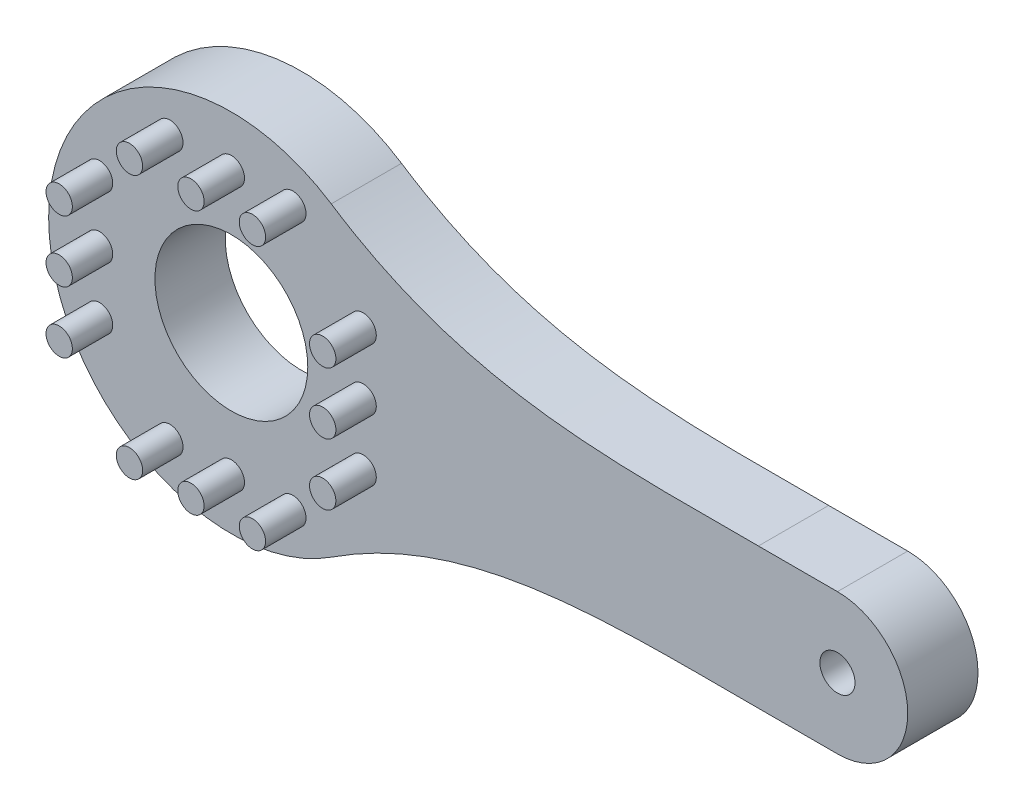
ISO-10303-21;
HEADER;
FILE_DESCRIPTION(('STEP AP214'),'2;1');
FILE_NAME('part.step','',(''),(''),'','','');
FILE_SCHEMA(('AUTOMOTIVE_DESIGN { 1 0 10303 214 1 1 1 1 }'));
ENDSEC;
DATA;
#1=APPLICATION_CONTEXT('core data for automotive mechanical design processes');
#2=APPLICATION_PROTOCOL_DEFINITION('international standard','automotive_design',2000,#1);
#3=PRODUCT_CONTEXT('',#1,'mechanical');
#4=PRODUCT('Part','Part','',(#3));
#5=PRODUCT_RELATED_PRODUCT_CATEGORY('part','',(#4));
#6=PRODUCT_DEFINITION_FORMATION('','',#4);
#7=PRODUCT_DEFINITION_CONTEXT('part definition',#1,'design');
#8=PRODUCT_DEFINITION('design','',#6,#7);
#9=PRODUCT_DEFINITION_SHAPE('','',#8);
#10=(LENGTH_UNIT() NAMED_UNIT(*) SI_UNIT(.MILLI.,.METRE.));
#11=(NAMED_UNIT(*) PLANE_ANGLE_UNIT() SI_UNIT($,.RADIAN.));
#12=(NAMED_UNIT(*) SI_UNIT($,.STERADIAN.) SOLID_ANGLE_UNIT());
#13=UNCERTAINTY_MEASURE_WITH_UNIT(LENGTH_MEASURE(1.E-05),#10,'distance_accuracy_value','');
#14=(GEOMETRIC_REPRESENTATION_CONTEXT(3) GLOBAL_UNCERTAINTY_ASSIGNED_CONTEXT((#13)) GLOBAL_UNIT_ASSIGNED_CONTEXT((#10,
#11,#12)) REPRESENTATION_CONTEXT('',''));
#15=CARTESIAN_POINT('',(0.,0.,0.));
#16=DIRECTION('',(0.,0.,1.));
#17=DIRECTION('',(1.,0.,0.));
#18=AXIS2_PLACEMENT_3D('',#15,#16,#17);
#19=CARTESIAN_POINT('',(17.4647591380404,4.46248690203293,4.));
#20=DIRECTION('',(0.,0.,-1.));
#21=DIRECTION('',(-1.,0.,0.));
#22=AXIS2_PLACEMENT_3D('',#19,#20,#21);
#23=PLANE('',#22);
#24=CARTESIAN_POINT('',(-7.5,3.5,4.));
#25=DIRECTION('',(0.,0.,-1.));
#26=DIRECTION('',(-1.,0.,0.));
#27=AXIS2_PLACEMENT_3D('',#24,#25,#26);
#28=CIRCLE('',#27,0.75);
#29=CARTESIAN_POINT('',(-8.25,3.5,4.));
#30=VERTEX_POINT('',#29);
#31=EDGE_CURVE('E11',#30,#30,#28,.F.);
#32=ORIENTED_EDGE('',*,*,#31,.F.);
#33=EDGE_LOOP('',(#32));
#34=FACE_BOUND('',#33,.T.);
#35=CARTESIAN_POINT('',(-7.5,0.,4.));
#36=DIRECTION('',(0.,0.,-1.));
#37=DIRECTION('',(-1.,0.,0.));
#38=AXIS2_PLACEMENT_3D('',#35,#36,#37);
#39=CIRCLE('',#38,0.749999999999998);
#40=CARTESIAN_POINT('',(-8.25,0.,4.));
#41=VERTEX_POINT('',#40);
#42=EDGE_CURVE('E51',#41,#41,#39,.F.);
#43=ORIENTED_EDGE('',*,*,#42,.F.);
#44=EDGE_LOOP('',(#43));
#45=FACE_BOUND('',#44,.T.);
#46=CARTESIAN_POINT('',(-7.5,-3.5,4.));
#47=DIRECTION('',(0.,0.,-1.));
#48=DIRECTION('',(-1.,0.,0.));
#49=AXIS2_PLACEMENT_3D('',#46,#47,#48);
#50=CIRCLE('',#49,0.75);
#51=CARTESIAN_POINT('',(-8.25,-3.5,4.));
#52=VERTEX_POINT('',#51);
#53=EDGE_CURVE('E185',#52,#52,#50,.F.);
#54=ORIENTED_EDGE('',*,*,#53,.F.);
#55=EDGE_LOOP('',(#54));
#56=FACE_BOUND('',#55,.T.);
#57=CARTESIAN_POINT('',(7.5,-3.5,4.));
#58=DIRECTION('',(0.,0.,-1.));
#59=DIRECTION('',(-1.,0.,0.));
#60=AXIS2_PLACEMENT_3D('',#57,#58,#59);
#61=CIRCLE('',#60,0.75);
#62=CARTESIAN_POINT('',(6.75,-3.5,4.));
#63=VERTEX_POINT('',#62);
#64=EDGE_CURVE('E182',#63,#63,#61,.F.);
#65=ORIENTED_EDGE('',*,*,#64,.F.);
#66=EDGE_LOOP('',(#65));
#67=FACE_BOUND('',#66,.T.);
#68=CARTESIAN_POINT('',(7.5,0.,4.));
#69=DIRECTION('',(0.,0.,-1.));
#70=DIRECTION('',(-1.,0.,0.));
#71=AXIS2_PLACEMENT_3D('',#68,#69,#70);
#72=CIRCLE('',#71,0.749999999999998);
#73=CARTESIAN_POINT('',(6.75,0.,4.));
#74=VERTEX_POINT('',#73);
#75=EDGE_CURVE('E179',#74,#74,#72,.F.);
#76=ORIENTED_EDGE('',*,*,#75,.F.);
#77=EDGE_LOOP('',(#76));
#78=FACE_BOUND('',#77,.T.);
#79=CARTESIAN_POINT('',(-3.5,-7.5,4.));
#80=DIRECTION('',(0.,0.,-1.));
#81=DIRECTION('',(-1.,0.,0.));
#82=AXIS2_PLACEMENT_3D('',#79,#80,#81);
#83=CIRCLE('',#82,0.749999999999999);
#84=CARTESIAN_POINT('',(-4.25,-7.5,4.));
#85=VERTEX_POINT('',#84);
#86=EDGE_CURVE('E176',#85,#85,#83,.F.);
#87=ORIENTED_EDGE('',*,*,#86,.F.);
#88=EDGE_LOOP('',(#87));
#89=FACE_BOUND('',#88,.T.);
#90=CARTESIAN_POINT('',(0.,-7.5,4.));
#91=DIRECTION('',(0.,0.,-1.));
#92=DIRECTION('',(-1.,0.,0.));
#93=AXIS2_PLACEMENT_3D('',#90,#91,#92);
#94=CIRCLE('',#93,0.75);
#95=CARTESIAN_POINT('',(-0.750000000000001,-7.5,4.));
#96=VERTEX_POINT('',#95);
#97=EDGE_CURVE('E173',#96,#96,#94,.F.);
#98=ORIENTED_EDGE('',*,*,#97,.F.);
#99=EDGE_LOOP('',(#98));
#100=FACE_BOUND('',#99,.T.);
#101=CARTESIAN_POINT('',(3.5,-7.5,4.));
#102=DIRECTION('',(0.,0.,-1.));
#103=DIRECTION('',(-1.,0.,0.));
#104=AXIS2_PLACEMENT_3D('',#101,#102,#103);
#105=CIRCLE('',#104,0.749999999999999);
#106=CARTESIAN_POINT('',(2.75,-7.5,4.));
#107=VERTEX_POINT('',#106);
#108=EDGE_CURVE('E170',#107,#107,#105,.F.);
#109=ORIENTED_EDGE('',*,*,#108,.F.);
#110=EDGE_LOOP('',(#109));
#111=FACE_BOUND('',#110,.T.);
#112=CARTESIAN_POINT('',(-3.5,7.5,4.));
#113=DIRECTION('',(0.,0.,-1.));
#114=DIRECTION('',(-1.,0.,0.));
#115=AXIS2_PLACEMENT_3D('',#112,#113,#114);
#116=CIRCLE('',#115,0.749999999999999);
#117=CARTESIAN_POINT('',(-4.25,7.5,4.));
#118=VERTEX_POINT('',#117);
#119=EDGE_CURVE('E167',#118,#118,#116,.F.);
#120=ORIENTED_EDGE('',*,*,#119,.F.);
#121=EDGE_LOOP('',(#120));
#122=FACE_BOUND('',#121,.T.);
#123=CARTESIAN_POINT('',(7.5,3.5,4.));
#124=DIRECTION('',(0.,0.,-1.));
#125=DIRECTION('',(-1.,0.,0.));
#126=AXIS2_PLACEMENT_3D('',#123,#124,#125);
#127=CIRCLE('',#126,0.75);
#128=CARTESIAN_POINT('',(6.75,3.5,4.));
#129=VERTEX_POINT('',#128);
#130=EDGE_CURVE('E164',#129,#129,#127,.F.);
#131=ORIENTED_EDGE('',*,*,#130,.F.);
#132=EDGE_LOOP('',(#131));
#133=FACE_BOUND('',#132,.T.);
#134=CARTESIAN_POINT('',(3.5,7.5,4.));
#135=DIRECTION('',(0.,0.,-1.));
#136=DIRECTION('',(-1.,0.,0.));
#137=AXIS2_PLACEMENT_3D('',#134,#135,#136);
#138=CIRCLE('',#137,0.749999999999999);
#139=CARTESIAN_POINT('',(2.75,7.5,4.));
#140=VERTEX_POINT('',#139);
#141=EDGE_CURVE('E161',#140,#140,#138,.F.);
#142=ORIENTED_EDGE('',*,*,#141,.F.);
#143=EDGE_LOOP('',(#142));
#144=FACE_BOUND('',#143,.T.);
#145=CARTESIAN_POINT('',(0.,7.5,4.));
#146=DIRECTION('',(0.,0.,-1.));
#147=DIRECTION('',(-1.,0.,0.));
#148=AXIS2_PLACEMENT_3D('',#145,#146,#147);
#149=CIRCLE('',#148,0.75);
#150=CARTESIAN_POINT('',(-0.750000000000001,7.5,4.));
#151=VERTEX_POINT('',#150);
#152=EDGE_CURVE('E158',#151,#151,#149,.F.);
#153=ORIENTED_EDGE('',*,*,#152,.F.);
#154=EDGE_LOOP('',(#153));
#155=FACE_BOUND('',#154,.T.);
#156=CARTESIAN_POINT('',(30.,4.,4.));
#157=CARTESIAN_POINT('',(21.2668653818899,4.,4.));
#158=CARTESIAN_POINT('',(13.4104279790372,3.66400440550072,4.));
#159=CARTESIAN_POINT('',(5.68619302154209,8.70788199976125,4.));
#160=B_SPLINE_CURVE_WITH_KNOTS('',3,(#156,#157,#158,#159),.UNSPECIFIED.,.F.,.F.,(4,4),(0.,1.),.UNSPECIFIED.);
#161=CARTESIAN_POINT('',(30.,4.,4.));
#162=VERTEX_POINT('',#161);
#163=CARTESIAN_POINT('',(5.68619302154209,8.70788199976125,4.));
#164=VERTEX_POINT('',#163);
#165=EDGE_CURVE('E149',#162,#164,#160,.T.);
#166=ORIENTED_EDGE('',*,*,#165,.T.);
#167=CARTESIAN_POINT('',(0.,0.,4.));
#168=DIRECTION('',(0.,0.,1.));
#169=DIRECTION('',(1.,0.,0.));
#170=AXIS2_PLACEMENT_3D('',#167,#168,#169);
#171=CIRCLE('',#170,10.4);
#172=CARTESIAN_POINT('',(5.68619302154209,-8.70788199976125,4.));
#173=VERTEX_POINT('',#172);
#174=EDGE_CURVE('E97',#164,#173,#171,.T.);
#175=ORIENTED_EDGE('',*,*,#174,.T.);
#176=CARTESIAN_POINT('',(5.68619302154209,-8.70788199976125,4.));
#177=CARTESIAN_POINT('',(13.4104279790372,-3.66400440550072,4.));
#178=CARTESIAN_POINT('',(21.2668653818899,-4.,4.));
#179=CARTESIAN_POINT('',(30.,-4.,4.));
#180=B_SPLINE_CURVE_WITH_KNOTS('',3,(#176,#177,#178,#179),.UNSPECIFIED.,.F.,.F.,(4,4),(0.,1.),.UNSPECIFIED.);
#181=CARTESIAN_POINT('',(30.,-4.,4.));
#182=VERTEX_POINT('',#181);
#183=EDGE_CURVE('E110',#173,#182,#180,.T.);
#184=ORIENTED_EDGE('',*,*,#183,.T.);
#185=DIRECTION('',(1.,0.,0.));
#186=VECTOR('',#185,1.);
#187=CARTESIAN_POINT('',(30.,-4.,4.));
#188=LINE('',#187,#186);
#189=CARTESIAN_POINT('',(34.5,-4.,4.));
#190=VERTEX_POINT('',#189);
#191=EDGE_CURVE('E104',#182,#190,#188,.T.);
#192=ORIENTED_EDGE('',*,*,#191,.T.);
#193=CARTESIAN_POINT('',(34.5,0.,4.));
#194=DIRECTION('',(0.,0.,1.));
#195=DIRECTION('',(-1.,0.,0.));
#196=AXIS2_PLACEMENT_3D('',#193,#194,#195);
#197=CIRCLE('',#196,4.);
#198=CARTESIAN_POINT('',(34.5,4.,4.));
#199=VERTEX_POINT('',#198);
#200=EDGE_CURVE('E108',#190,#199,#197,.T.);
#201=ORIENTED_EDGE('',*,*,#200,.T.);
#202=DIRECTION('',(-1.,0.,0.));
#203=VECTOR('',#202,1.);
#204=CARTESIAN_POINT('',(30.,4.,4.));
#205=LINE('',#204,#203);
#206=EDGE_CURVE('E59',#199,#162,#205,.T.);
#207=ORIENTED_EDGE('',*,*,#206,.T.);
#208=EDGE_LOOP('',(#166,#175,#184,#192,#201,#207));
#209=FACE_BOUND('',#208,.T.);
#210=CARTESIAN_POINT('',(34.5,0.,4.));
#211=DIRECTION('',(0.,0.,1.));
#212=DIRECTION('',(1.,0.,0.));
#213=AXIS2_PLACEMENT_3D('',#210,#211,#212);
#214=CIRCLE('',#213,0.999999999999998);
#215=CARTESIAN_POINT('',(35.5,0.,4.));
#216=VERTEX_POINT('',#215);
#217=EDGE_CURVE('E134',#216,#216,#214,.T.);
#218=ORIENTED_EDGE('',*,*,#217,.F.);
#219=EDGE_LOOP('',(#218));
#220=FACE_BOUND('',#219,.T.);
#221=CARTESIAN_POINT('',(0.,0.,4.));
#222=DIRECTION('',(0.,0.,1.));
#223=DIRECTION('',(1.,0.,0.));
#224=AXIS2_PLACEMENT_3D('',#221,#222,#223);
#225=CIRCLE('',#224,4.35);
#226=CARTESIAN_POINT('',(4.35,0.,4.));
#227=VERTEX_POINT('',#226);
#228=EDGE_CURVE('E270',#227,#227,#225,.T.);
#229=ORIENTED_EDGE('',*,*,#228,.F.);
#230=EDGE_LOOP('',(#229));
#231=FACE_BOUND('',#230,.T.);
#232=ADVANCED_FACE('F41',(#34,#45,#56,#67,#78,#89,#100,#111,#122,#133,#144,#155,#209,#220,#231),
#23,.F.);
#233=CARTESIAN_POINT('',(17.4647591380404,4.46248690203293,0.));
#234=DIRECTION('',(0.,0.,-1.));
#235=DIRECTION('',(-1.,0.,0.));
#236=AXIS2_PLACEMENT_3D('',#233,#234,#235);
#237=PLANE('',#236);
#238=CARTESIAN_POINT('',(34.5,0.,0.));
#239=DIRECTION('',(0.,0.,1.));
#240=DIRECTION('',(1.,0.,0.));
#241=AXIS2_PLACEMENT_3D('',#238,#239,#240);
#242=CIRCLE('',#241,0.999999999999998);
#243=CARTESIAN_POINT('',(35.5,0.,0.));
#244=VERTEX_POINT('',#243);
#245=EDGE_CURVE('E264',#244,#244,#242,.T.);
#246=ORIENTED_EDGE('',*,*,#245,.T.);
#247=EDGE_LOOP('',(#246));
#248=FACE_BOUND('',#247,.T.);
#249=CARTESIAN_POINT('',(30.,4.,0.));
#250=CARTESIAN_POINT('',(21.2668653818899,4.,0.));
#251=CARTESIAN_POINT('',(13.4104279790372,3.66400440550072,0.));
#252=CARTESIAN_POINT('',(5.68619302154209,8.70788199976125,0.));
#253=B_SPLINE_CURVE_WITH_KNOTS('',3,(#249,#250,#251,#252),.UNSPECIFIED.,.F.,.F.,(4,4),(0.,1.),.UNSPECIFIED.);
#254=CARTESIAN_POINT('',(30.,4.,0.));
#255=VERTEX_POINT('',#254);
#256=CARTESIAN_POINT('',(5.68619302154209,8.70788199976125,0.));
#257=VERTEX_POINT('',#256);
#258=EDGE_CURVE('E128',#255,#257,#253,.T.);
#259=ORIENTED_EDGE('',*,*,#258,.F.);
#260=DIRECTION('',(-1.,0.,0.));
#261=VECTOR('',#260,1.);
#262=CARTESIAN_POINT('',(30.,4.,0.));
#263=LINE('',#262,#261);
#264=CARTESIAN_POINT('',(34.5,4.,0.));
#265=VERTEX_POINT('',#264);
#266=EDGE_CURVE('E88',#265,#255,#263,.T.);
#267=ORIENTED_EDGE('',*,*,#266,.F.);
#268=CARTESIAN_POINT('',(34.5,0.,0.));
#269=DIRECTION('',(0.,0.,1.));
#270=DIRECTION('',(-1.,0.,0.));
#271=AXIS2_PLACEMENT_3D('',#268,#269,#270);
#272=CIRCLE('',#271,4.);
#273=CARTESIAN_POINT('',(34.5,-4.,0.));
#274=VERTEX_POINT('',#273);
#275=EDGE_CURVE('E82',#274,#265,#272,.T.);
#276=ORIENTED_EDGE('',*,*,#275,.F.);
#277=DIRECTION('',(1.,0.,0.));
#278=VECTOR('',#277,1.);
#279=CARTESIAN_POINT('',(30.,-4.,0.));
#280=LINE('',#279,#278);
#281=CARTESIAN_POINT('',(30.,-4.,0.));
#282=VERTEX_POINT('',#281);
#283=EDGE_CURVE('E118',#282,#274,#280,.T.);
#284=ORIENTED_EDGE('',*,*,#283,.F.);
#285=CARTESIAN_POINT('',(5.68619302154209,-8.70788199976125,0.));
#286=CARTESIAN_POINT('',(13.4104279790372,-3.66400440550072,0.));
#287=CARTESIAN_POINT('',(21.2668653818899,-4.,0.));
#288=CARTESIAN_POINT('',(30.,-4.,0.));
#289=B_SPLINE_CURVE_WITH_KNOTS('',3,(#285,#286,#287,#288),.UNSPECIFIED.,.F.,.F.,(4,4),(0.,1.),.UNSPECIFIED.);
#290=CARTESIAN_POINT('',(5.68619302154209,-8.70788199976125,0.));
#291=VERTEX_POINT('',#290);
#292=EDGE_CURVE('E139',#291,#282,#289,.T.);
#293=ORIENTED_EDGE('',*,*,#292,.F.);
#294=CARTESIAN_POINT('',(0.,0.,0.));
#295=DIRECTION('',(0.,0.,1.));
#296=DIRECTION('',(1.,0.,0.));
#297=AXIS2_PLACEMENT_3D('',#294,#295,#296);
#298=CIRCLE('',#297,10.4);
#299=EDGE_CURVE('E133',#257,#291,#298,.T.);
#300=ORIENTED_EDGE('',*,*,#299,.F.);
#301=EDGE_LOOP('',(#259,#267,#276,#284,#293,#300));
#302=FACE_BOUND('',#301,.T.);
#303=CARTESIAN_POINT('',(0.,0.,0.));
#304=DIRECTION('',(0.,0.,1.));
#305=DIRECTION('',(1.,0.,0.));
#306=AXIS2_PLACEMENT_3D('',#303,#304,#305);
#307=CIRCLE('',#306,4.35);
#308=CARTESIAN_POINT('',(4.35,0.,0.));
#309=VERTEX_POINT('',#308);
#310=EDGE_CURVE('E273',#309,#309,#307,.T.);
#311=ORIENTED_EDGE('',*,*,#310,.T.);
#312=EDGE_LOOP('',(#311));
#313=FACE_BOUND('',#312,.T.);
#314=ADVANCED_FACE('F194',(#248,#302,#313),#237,.T.);
#315=DIRECTION('',(0.,0.,-1.));
#316=VECTOR('',#315,1.);
#317=SURFACE_OF_LINEAR_EXTRUSION('',#160,#316);
#318=ORIENTED_EDGE('',*,*,#258,.T.);
#319=DIRECTION('',(0.,0.,-1.));
#320=VECTOR('',#319,1.);
#321=CARTESIAN_POINT('',(5.68619302154209,8.70788199976125,4.));
#322=LINE('',#321,#320);
#323=EDGE_CURVE('E156',#164,#257,#322,.T.);
#324=ORIENTED_EDGE('',*,*,#323,.F.);
#325=ORIENTED_EDGE('',*,*,#165,.F.);
#326=DIRECTION('',(0.,0.,-1.));
#327=VECTOR('',#326,1.);
#328=CARTESIAN_POINT('',(30.,4.,4.));
#329=LINE('',#328,#327);
#330=EDGE_CURVE('E124',#162,#255,#329,.T.);
#331=ORIENTED_EDGE('',*,*,#330,.T.);
#332=EDGE_LOOP('',(#318,#324,#325,#331));
#333=FACE_BOUND('',#332,.T.);
#334=ADVANCED_FACE('F43',(#333),#317,.F.);
#335=CARTESIAN_POINT('',(0.,0.,4.));
#336=DIRECTION('',(0.,0.,-1.));
#337=DIRECTION('',(-1.,0.,0.));
#338=AXIS2_PLACEMENT_3D('',#335,#336,#337);
#339=CYLINDRICAL_SURFACE('',#338,10.4);
#340=ORIENTED_EDGE('',*,*,#299,.T.);
#341=DIRECTION('',(0.,0.,-1.));
#342=VECTOR('',#341,1.);
#343=CARTESIAN_POINT('',(5.68619302154209,-8.70788199976125,4.));
#344=LINE('',#343,#342);
#345=EDGE_CURVE('E153',#173,#291,#344,.T.);
#346=ORIENTED_EDGE('',*,*,#345,.F.);
#347=ORIENTED_EDGE('',*,*,#174,.F.);
#348=ORIENTED_EDGE('',*,*,#323,.T.);
#349=EDGE_LOOP('',(#340,#346,#347,#348));
#350=FACE_BOUND('',#349,.T.);
#351=ADVANCED_FACE('F251',(#350),#339,.T.);
#352=DIRECTION('',(0.,0.,-1.));
#353=VECTOR('',#352,1.);
#354=SURFACE_OF_LINEAR_EXTRUSION('',#180,#353);
#355=ORIENTED_EDGE('',*,*,#292,.T.);
#356=DIRECTION('',(0.,0.,-1.));
#357=VECTOR('',#356,1.);
#358=CARTESIAN_POINT('',(30.,-4.,4.));
#359=LINE('',#358,#357);
#360=EDGE_CURVE('E119',#182,#282,#359,.T.);
#361=ORIENTED_EDGE('',*,*,#360,.F.);
#362=ORIENTED_EDGE('',*,*,#183,.F.);
#363=ORIENTED_EDGE('',*,*,#345,.T.);
#364=EDGE_LOOP('',(#355,#361,#362,#363));
#365=FACE_BOUND('',#364,.T.);
#366=ADVANCED_FACE('F249',(#365),#354,.F.);
#367=CARTESIAN_POINT('',(30.,-4.,4.));
#368=DIRECTION('',(0.,1.,0.));
#369=DIRECTION('',(0.,0.,1.));
#370=AXIS2_PLACEMENT_3D('',#367,#368,#369);
#371=PLANE('',#370);
#372=ORIENTED_EDGE('',*,*,#283,.T.);
#373=DIRECTION('',(0.,0.,-1.));
#374=VECTOR('',#373,1.);
#375=CARTESIAN_POINT('',(34.5,-4.,4.));
#376=LINE('',#375,#374);
#377=EDGE_CURVE('E115',#190,#274,#376,.T.);
#378=ORIENTED_EDGE('',*,*,#377,.F.);
#379=ORIENTED_EDGE('',*,*,#191,.F.);
#380=ORIENTED_EDGE('',*,*,#360,.T.);
#381=EDGE_LOOP('',(#372,#378,#379,#380));
#382=FACE_BOUND('',#381,.T.);
#383=ADVANCED_FACE('F116',(#382),#371,.F.);
#384=CARTESIAN_POINT('',(34.5,0.,4.));
#385=DIRECTION('',(0.,0.,-1.));
#386=DIRECTION('',(-1.,0.,0.));
#387=AXIS2_PLACEMENT_3D('',#384,#385,#386);
#388=CYLINDRICAL_SURFACE('',#387,4.);
#389=ORIENTED_EDGE('',*,*,#275,.T.);
#390=DIRECTION('',(0.,0.,-1.));
#391=VECTOR('',#390,1.);
#392=CARTESIAN_POINT('',(34.5,4.,4.));
#393=LINE('',#392,#391);
#394=EDGE_CURVE('E120',#199,#265,#393,.T.);
#395=ORIENTED_EDGE('',*,*,#394,.F.);
#396=ORIENTED_EDGE('',*,*,#200,.F.);
#397=ORIENTED_EDGE('',*,*,#377,.T.);
#398=EDGE_LOOP('',(#389,#395,#396,#397));
#399=FACE_BOUND('',#398,.T.);
#400=ADVANCED_FACE('F122',(#399),#388,.T.);
#401=CARTESIAN_POINT('',(30.,4.,4.));
#402=DIRECTION('',(0.,-1.,0.));
#403=DIRECTION('',(0.,0.,-1.));
#404=AXIS2_PLACEMENT_3D('',#401,#402,#403);
#405=PLANE('',#404);
#406=ORIENTED_EDGE('',*,*,#266,.T.);
#407=ORIENTED_EDGE('',*,*,#330,.F.);
#408=ORIENTED_EDGE('',*,*,#206,.F.);
#409=ORIENTED_EDGE('',*,*,#394,.T.);
#410=EDGE_LOOP('',(#406,#407,#408,#409));
#411=FACE_BOUND('',#410,.T.);
#412=ADVANCED_FACE('F237',(#411),#405,.F.);
#413=CARTESIAN_POINT('',(34.5,0.,4.));
#414=DIRECTION('',(0.,0.,-1.));
#415=DIRECTION('',(-1.,0.,0.));
#416=AXIS2_PLACEMENT_3D('',#413,#414,#415);
#417=CYLINDRICAL_SURFACE('',#416,0.999999999999998);
#418=ORIENTED_EDGE('',*,*,#217,.T.);
#419=EDGE_LOOP('',(#418));
#420=FACE_BOUND('',#419,.T.);
#421=ORIENTED_EDGE('',*,*,#245,.F.);
#422=EDGE_LOOP('',(#421));
#423=FACE_BOUND('',#422,.T.);
#424=ADVANCED_FACE('F230',(#420,#423),#417,.F.);
#425=CARTESIAN_POINT('',(0.,0.,4.));
#426=DIRECTION('',(0.,0.,-1.));
#427=DIRECTION('',(-1.,0.,0.));
#428=AXIS2_PLACEMENT_3D('',#425,#426,#427);
#429=CYLINDRICAL_SURFACE('',#428,4.35);
#430=ORIENTED_EDGE('',*,*,#228,.T.);
#431=EDGE_LOOP('',(#430));
#432=FACE_BOUND('',#431,.T.);
#433=ORIENTED_EDGE('',*,*,#310,.F.);
#434=EDGE_LOOP('',(#433));
#435=FACE_BOUND('',#434,.T.);
#436=ADVANCED_FACE('F220',(#432,#435),#429,.F.);
#437=CARTESIAN_POINT('',(0.,7.5,6.3));
#438=DIRECTION('',(0.,0.,-1.));
#439=DIRECTION('',(-1.,0.,0.));
#440=AXIS2_PLACEMENT_3D('',#437,#438,#439);
#441=CYLINDRICAL_SURFACE('',#440,0.75);
#442=CARTESIAN_POINT('',(0.,7.5,6.3));
#443=DIRECTION('',(0.,0.,1.));
#444=DIRECTION('',(1.,0.,0.));
#445=AXIS2_PLACEMENT_3D('',#442,#443,#444);
#446=CIRCLE('',#445,0.75);
#447=CARTESIAN_POINT('',(0.749999999999999,7.5,6.3));
#448=VERTEX_POINT('',#447);
#449=EDGE_CURVE('E276',#448,#448,#446,.T.);
#450=ORIENTED_EDGE('',*,*,#449,.F.);
#451=EDGE_LOOP('',(#450));
#452=FACE_BOUND('',#451,.T.);
#453=ORIENTED_EDGE('',*,*,#152,.T.);
#454=EDGE_LOOP('',(#453));
#455=FACE_BOUND('',#454,.T.);
#456=ADVANCED_FACE('F217',(#452,#455),#441,.T.);
#457=CARTESIAN_POINT('',(0.,7.5,6.3));
#458=DIRECTION('',(0.,0.,1.));
#459=DIRECTION('',(1.,0.,0.));
#460=AXIS2_PLACEMENT_3D('',#457,#458,#459);
#461=PLANE('',#460);
#462=ORIENTED_EDGE('',*,*,#449,.T.);
#463=EDGE_LOOP('',(#462));
#464=FACE_BOUND('',#463,.T.);
#465=ADVANCED_FACE('F219',(#464),#461,.T.);
#466=CARTESIAN_POINT('',(3.5,7.5,6.3));
#467=DIRECTION('',(0.,0.,-1.));
#468=DIRECTION('',(-1.,0.,0.));
#469=AXIS2_PLACEMENT_3D('',#466,#467,#468);
#470=CYLINDRICAL_SURFACE('',#469,0.749999999999999);
#471=CARTESIAN_POINT('',(3.5,7.5,6.3));
#472=DIRECTION('',(0.,0.,1.));
#473=DIRECTION('',(1.,0.,0.));
#474=AXIS2_PLACEMENT_3D('',#471,#472,#473);
#475=CIRCLE('',#474,0.749999999999999);
#476=CARTESIAN_POINT('',(4.25,7.5,6.3));
#477=VERTEX_POINT('',#476);
#478=EDGE_CURVE('E281',#477,#477,#475,.T.);
#479=ORIENTED_EDGE('',*,*,#478,.F.);
#480=EDGE_LOOP('',(#479));
#481=FACE_BOUND('',#480,.T.);
#482=ORIENTED_EDGE('',*,*,#141,.T.);
#483=EDGE_LOOP('',(#482));
#484=FACE_BOUND('',#483,.T.);
#485=ADVANCED_FACE('F227',(#481,#484),#470,.T.);
#486=CARTESIAN_POINT('',(3.5,7.5,6.3));
#487=DIRECTION('',(0.,0.,1.));
#488=DIRECTION('',(1.,0.,0.));
#489=AXIS2_PLACEMENT_3D('',#486,#487,#488);
#490=PLANE('',#489);
#491=ORIENTED_EDGE('',*,*,#478,.T.);
#492=EDGE_LOOP('',(#491));
#493=FACE_BOUND('',#492,.T.);
#494=ADVANCED_FACE('F397',(#493),#490,.T.);
#495=CARTESIAN_POINT('',(7.5,3.5,6.3));
#496=DIRECTION('',(0.,0.,-1.));
#497=DIRECTION('',(-1.,0.,0.));
#498=AXIS2_PLACEMENT_3D('',#495,#496,#497);
#499=CYLINDRICAL_SURFACE('',#498,0.75);
#500=CARTESIAN_POINT('',(7.5,3.5,6.3));
#501=DIRECTION('',(0.,0.,1.));
#502=DIRECTION('',(1.,0.,0.));
#503=AXIS2_PLACEMENT_3D('',#500,#501,#502);
#504=CIRCLE('',#503,0.75);
#505=CARTESIAN_POINT('',(8.25,3.5,6.3));
#506=VERTEX_POINT('',#505);
#507=EDGE_CURVE('E284',#506,#506,#504,.T.);
#508=ORIENTED_EDGE('',*,*,#507,.F.);
#509=EDGE_LOOP('',(#508));
#510=FACE_BOUND('',#509,.T.);
#511=ORIENTED_EDGE('',*,*,#130,.T.);
#512=EDGE_LOOP('',(#511));
#513=FACE_BOUND('',#512,.T.);
#514=ADVANCED_FACE('F393',(#510,#513),#499,.T.);
#515=CARTESIAN_POINT('',(7.5,3.5,6.3));
#516=DIRECTION('',(0.,0.,1.));
#517=DIRECTION('',(1.,0.,0.));
#518=AXIS2_PLACEMENT_3D('',#515,#516,#517);
#519=PLANE('',#518);
#520=ORIENTED_EDGE('',*,*,#507,.T.);
#521=EDGE_LOOP('',(#520));
#522=FACE_BOUND('',#521,.T.);
#523=ADVANCED_FACE('F389',(#522),#519,.T.);
#524=CARTESIAN_POINT('',(-3.5,7.5,6.3));
#525=DIRECTION('',(0.,0.,-1.));
#526=DIRECTION('',(-1.,0.,0.));
#527=AXIS2_PLACEMENT_3D('',#524,#525,#526);
#528=CYLINDRICAL_SURFACE('',#527,0.749999999999999);
#529=CARTESIAN_POINT('',(-3.5,7.5,6.3));
#530=DIRECTION('',(0.,0.,1.));
#531=DIRECTION('',(-1.,0.,0.));
#532=AXIS2_PLACEMENT_3D('',#529,#530,#531);
#533=CIRCLE('',#532,0.749999999999999);
#534=CARTESIAN_POINT('',(-4.25,7.5,6.3));
#535=VERTEX_POINT('',#534);
#536=EDGE_CURVE('E287',#535,#535,#533,.T.);
#537=ORIENTED_EDGE('',*,*,#536,.F.);
#538=EDGE_LOOP('',(#537));
#539=FACE_BOUND('',#538,.T.);
#540=ORIENTED_EDGE('',*,*,#119,.T.);
#541=EDGE_LOOP('',(#540));
#542=FACE_BOUND('',#541,.T.);
#543=ADVANCED_FACE('F385',(#539,#542),#528,.T.);
#544=CARTESIAN_POINT('',(-3.5,7.5,6.3));
#545=DIRECTION('',(0.,0.,-1.));
#546=DIRECTION('',(-1.,0.,0.));
#547=AXIS2_PLACEMENT_3D('',#544,#545,#546);
#548=PLANE('',#547);
#549=ORIENTED_EDGE('',*,*,#536,.T.);
#550=EDGE_LOOP('',(#549));
#551=FACE_BOUND('',#550,.T.);
#552=ADVANCED_FACE('F381',(#551),#548,.F.);
#553=CARTESIAN_POINT('',(3.5,-7.5,6.3));
#554=DIRECTION('',(0.,0.,-1.));
#555=DIRECTION('',(-1.,0.,0.));
#556=AXIS2_PLACEMENT_3D('',#553,#554,#555);
#557=CYLINDRICAL_SURFACE('',#556,0.749999999999999);
#558=CARTESIAN_POINT('',(3.5,-7.5,6.3));
#559=DIRECTION('',(0.,0.,1.));
#560=DIRECTION('',(-1.,0.,0.));
#561=AXIS2_PLACEMENT_3D('',#558,#559,#560);
#562=CIRCLE('',#561,0.749999999999999);
#563=CARTESIAN_POINT('',(2.75,-7.5,6.3));
#564=VERTEX_POINT('',#563);
#565=EDGE_CURVE('E290',#564,#564,#562,.T.);
#566=ORIENTED_EDGE('',*,*,#565,.F.);
#567=EDGE_LOOP('',(#566));
#568=FACE_BOUND('',#567,.T.);
#569=ORIENTED_EDGE('',*,*,#108,.T.);
#570=EDGE_LOOP('',(#569));
#571=FACE_BOUND('',#570,.T.);
#572=ADVANCED_FACE('F377',(#568,#571),#557,.T.);
#573=CARTESIAN_POINT('',(3.5,-7.5,6.3));
#574=DIRECTION('',(0.,0.,-1.));
#575=DIRECTION('',(-1.,0.,0.));
#576=AXIS2_PLACEMENT_3D('',#573,#574,#575);
#577=PLANE('',#576);
#578=ORIENTED_EDGE('',*,*,#565,.T.);
#579=EDGE_LOOP('',(#578));
#580=FACE_BOUND('',#579,.T.);
#581=ADVANCED_FACE('F373',(#580),#577,.F.);
#582=CARTESIAN_POINT('',(0.,-7.5,6.3));
#583=DIRECTION('',(0.,0.,-1.));
#584=DIRECTION('',(-1.,0.,0.));
#585=AXIS2_PLACEMENT_3D('',#582,#583,#584);
#586=CYLINDRICAL_SURFACE('',#585,0.75);
#587=CARTESIAN_POINT('',(0.,-7.5,6.3));
#588=DIRECTION('',(0.,0.,1.));
#589=DIRECTION('',(-1.,0.,0.));
#590=AXIS2_PLACEMENT_3D('',#587,#588,#589);
#591=CIRCLE('',#590,0.75);
#592=CARTESIAN_POINT('',(-0.750000000000001,-7.5,6.3));
#593=VERTEX_POINT('',#592);
#594=EDGE_CURVE('E293',#593,#593,#591,.T.);
#595=ORIENTED_EDGE('',*,*,#594,.F.);
#596=EDGE_LOOP('',(#595));
#597=FACE_BOUND('',#596,.T.);
#598=ORIENTED_EDGE('',*,*,#97,.T.);
#599=EDGE_LOOP('',(#598));
#600=FACE_BOUND('',#599,.T.);
#601=ADVANCED_FACE('F369',(#597,#600),#586,.T.);
#602=CARTESIAN_POINT('',(0.,-7.5,6.3));
#603=DIRECTION('',(0.,0.,-1.));
#604=DIRECTION('',(-1.,0.,0.));
#605=AXIS2_PLACEMENT_3D('',#602,#603,#604);
#606=PLANE('',#605);
#607=ORIENTED_EDGE('',*,*,#594,.T.);
#608=EDGE_LOOP('',(#607));
#609=FACE_BOUND('',#608,.T.);
#610=ADVANCED_FACE('F365',(#609),#606,.F.);
#611=CARTESIAN_POINT('',(-3.5,-7.5,6.3));
#612=DIRECTION('',(0.,0.,-1.));
#613=DIRECTION('',(-1.,0.,0.));
#614=AXIS2_PLACEMENT_3D('',#611,#612,#613);
#615=CYLINDRICAL_SURFACE('',#614,0.749999999999999);
#616=CARTESIAN_POINT('',(-3.5,-7.5,6.3));
#617=DIRECTION('',(0.,0.,1.));
#618=DIRECTION('',(1.,0.,0.));
#619=AXIS2_PLACEMENT_3D('',#616,#617,#618);
#620=CIRCLE('',#619,0.749999999999999);
#621=CARTESIAN_POINT('',(-2.75,-7.5,6.3));
#622=VERTEX_POINT('',#621);
#623=EDGE_CURVE('E296',#622,#622,#620,.T.);
#624=ORIENTED_EDGE('',*,*,#623,.F.);
#625=EDGE_LOOP('',(#624));
#626=FACE_BOUND('',#625,.T.);
#627=ORIENTED_EDGE('',*,*,#86,.T.);
#628=EDGE_LOOP('',(#627));
#629=FACE_BOUND('',#628,.T.);
#630=ADVANCED_FACE('F361',(#626,#629),#615,.T.);
#631=CARTESIAN_POINT('',(-3.5,-7.5,6.3));
#632=DIRECTION('',(0.,0.,1.));
#633=DIRECTION('',(1.,0.,0.));
#634=AXIS2_PLACEMENT_3D('',#631,#632,#633);
#635=PLANE('',#634);
#636=ORIENTED_EDGE('',*,*,#623,.T.);
#637=EDGE_LOOP('',(#636));
#638=FACE_BOUND('',#637,.T.);
#639=ADVANCED_FACE('F357',(#638),#635,.T.);
#640=CARTESIAN_POINT('',(7.5,0.,6.3));
#641=DIRECTION('',(0.,0.,-1.));
#642=DIRECTION('',(-1.,0.,0.));
#643=AXIS2_PLACEMENT_3D('',#640,#641,#642);
#644=CYLINDRICAL_SURFACE('',#643,0.749999999999998);
#645=CARTESIAN_POINT('',(7.5,0.,6.3));
#646=DIRECTION('',(0.,0.,1.));
#647=DIRECTION('',(1.,0.,0.));
#648=AXIS2_PLACEMENT_3D('',#645,#646,#647);
#649=CIRCLE('',#648,0.749999999999998);
#650=CARTESIAN_POINT('',(8.25,0.,6.3));
#651=VERTEX_POINT('',#650);
#652=EDGE_CURVE('E299',#651,#651,#649,.T.);
#653=ORIENTED_EDGE('',*,*,#652,.F.);
#654=EDGE_LOOP('',(#653));
#655=FACE_BOUND('',#654,.T.);
#656=ORIENTED_EDGE('',*,*,#75,.T.);
#657=EDGE_LOOP('',(#656));
#658=FACE_BOUND('',#657,.T.);
#659=ADVANCED_FACE('F353',(#655,#658),#644,.T.);
#660=CARTESIAN_POINT('',(7.5,0.,6.3));
#661=DIRECTION('',(0.,0.,1.));
#662=DIRECTION('',(1.,0.,0.));
#663=AXIS2_PLACEMENT_3D('',#660,#661,#662);
#664=PLANE('',#663);
#665=ORIENTED_EDGE('',*,*,#652,.T.);
#666=EDGE_LOOP('',(#665));
#667=FACE_BOUND('',#666,.T.);
#668=ADVANCED_FACE('F349',(#667),#664,.T.);
#669=CARTESIAN_POINT('',(7.5,-3.5,6.3));
#670=DIRECTION('',(0.,0.,-1.));
#671=DIRECTION('',(-1.,0.,0.));
#672=AXIS2_PLACEMENT_3D('',#669,#670,#671);
#673=CYLINDRICAL_SURFACE('',#672,0.75);
#674=CARTESIAN_POINT('',(7.5,-3.5,6.3));
#675=DIRECTION('',(0.,0.,1.));
#676=DIRECTION('',(-1.,0.,0.));
#677=AXIS2_PLACEMENT_3D('',#674,#675,#676);
#678=CIRCLE('',#677,0.75);
#679=CARTESIAN_POINT('',(6.75,-3.5,6.3));
#680=VERTEX_POINT('',#679);
#681=EDGE_CURVE('E302',#680,#680,#678,.T.);
#682=ORIENTED_EDGE('',*,*,#681,.F.);
#683=EDGE_LOOP('',(#682));
#684=FACE_BOUND('',#683,.T.);
#685=ORIENTED_EDGE('',*,*,#64,.T.);
#686=EDGE_LOOP('',(#685));
#687=FACE_BOUND('',#686,.T.);
#688=ADVANCED_FACE('F345',(#684,#687),#673,.T.);
#689=CARTESIAN_POINT('',(7.5,-3.5,6.3));
#690=DIRECTION('',(0.,0.,-1.));
#691=DIRECTION('',(-1.,0.,0.));
#692=AXIS2_PLACEMENT_3D('',#689,#690,#691);
#693=PLANE('',#692);
#694=ORIENTED_EDGE('',*,*,#681,.T.);
#695=EDGE_LOOP('',(#694));
#696=FACE_BOUND('',#695,.T.);
#697=ADVANCED_FACE('F341',(#696),#693,.F.);
#698=CARTESIAN_POINT('',(-7.5,-3.5,6.3));
#699=DIRECTION('',(0.,0.,-1.));
#700=DIRECTION('',(-1.,0.,0.));
#701=AXIS2_PLACEMENT_3D('',#698,#699,#700);
#702=CYLINDRICAL_SURFACE('',#701,0.75);
#703=CARTESIAN_POINT('',(-7.5,-3.5,6.3));
#704=DIRECTION('',(0.,0.,1.));
#705=DIRECTION('',(1.,0.,0.));
#706=AXIS2_PLACEMENT_3D('',#703,#704,#705);
#707=CIRCLE('',#706,0.75);
#708=CARTESIAN_POINT('',(-6.75,-3.5,6.3));
#709=VERTEX_POINT('',#708);
#710=EDGE_CURVE('E305',#709,#709,#707,.T.);
#711=ORIENTED_EDGE('',*,*,#710,.F.);
#712=EDGE_LOOP('',(#711));
#713=FACE_BOUND('',#712,.T.);
#714=ORIENTED_EDGE('',*,*,#53,.T.);
#715=EDGE_LOOP('',(#714));
#716=FACE_BOUND('',#715,.T.);
#717=ADVANCED_FACE('F337',(#713,#716),#702,.T.);
#718=CARTESIAN_POINT('',(-7.5,-3.5,6.3));
#719=DIRECTION('',(0.,0.,1.));
#720=DIRECTION('',(1.,0.,0.));
#721=AXIS2_PLACEMENT_3D('',#718,#719,#720);
#722=PLANE('',#721);
#723=ORIENTED_EDGE('',*,*,#710,.T.);
#724=EDGE_LOOP('',(#723));
#725=FACE_BOUND('',#724,.T.);
#726=ADVANCED_FACE('F333',(#725),#722,.T.);
#727=CARTESIAN_POINT('',(-7.5,0.,6.3));
#728=DIRECTION('',(0.,0.,-1.));
#729=DIRECTION('',(-1.,0.,0.));
#730=AXIS2_PLACEMENT_3D('',#727,#728,#729);
#731=CYLINDRICAL_SURFACE('',#730,0.749999999999998);
#732=CARTESIAN_POINT('',(-7.5,0.,6.3));
#733=DIRECTION('',(0.,0.,1.));
#734=DIRECTION('',(-1.,0.,0.));
#735=AXIS2_PLACEMENT_3D('',#732,#733,#734);
#736=CIRCLE('',#735,0.749999999999998);
#737=CARTESIAN_POINT('',(-8.25,0.,6.3));
#738=VERTEX_POINT('',#737);
#739=EDGE_CURVE('E308',#738,#738,#736,.T.);
#740=ORIENTED_EDGE('',*,*,#739,.F.);
#741=EDGE_LOOP('',(#740));
#742=FACE_BOUND('',#741,.T.);
#743=ORIENTED_EDGE('',*,*,#42,.T.);
#744=EDGE_LOOP('',(#743));
#745=FACE_BOUND('',#744,.T.);
#746=ADVANCED_FACE('F190',(#742,#745),#731,.T.);
#747=CARTESIAN_POINT('',(-7.5,0.,6.3));
#748=DIRECTION('',(0.,0.,-1.));
#749=DIRECTION('',(-1.,0.,0.));
#750=AXIS2_PLACEMENT_3D('',#747,#748,#749);
#751=PLANE('',#750);
#752=ORIENTED_EDGE('',*,*,#739,.T.);
#753=EDGE_LOOP('',(#752));
#754=FACE_BOUND('',#753,.T.);
#755=ADVANCED_FACE('F320',(#754),#751,.F.);
#756=CARTESIAN_POINT('',(-7.5,3.5,6.3));
#757=DIRECTION('',(0.,0.,-1.));
#758=DIRECTION('',(-1.,0.,0.));
#759=AXIS2_PLACEMENT_3D('',#756,#757,#758);
#760=CYLINDRICAL_SURFACE('',#759,0.75);
#761=CARTESIAN_POINT('',(-7.5,3.5,6.3));
#762=DIRECTION('',(0.,0.,1.));
#763=DIRECTION('',(-1.,0.,0.));
#764=AXIS2_PLACEMENT_3D('',#761,#762,#763);
#765=CIRCLE('',#764,0.75);
#766=CARTESIAN_POINT('',(-8.25,3.5,6.3));
#767=VERTEX_POINT('',#766);
#768=EDGE_CURVE('E311',#767,#767,#765,.T.);
#769=ORIENTED_EDGE('',*,*,#768,.F.);
#770=EDGE_LOOP('',(#769));
#771=FACE_BOUND('',#770,.T.);
#772=ORIENTED_EDGE('',*,*,#31,.T.);
#773=EDGE_LOOP('',(#772));
#774=FACE_BOUND('',#773,.T.);
#775=ADVANCED_FACE('F317',(#771,#774),#760,.T.);
#776=CARTESIAN_POINT('',(-7.5,3.5,6.3));
#777=DIRECTION('',(0.,0.,-1.));
#778=DIRECTION('',(-1.,0.,0.));
#779=AXIS2_PLACEMENT_3D('',#776,#777,#778);
#780=PLANE('',#779);
#781=ORIENTED_EDGE('',*,*,#768,.T.);
#782=EDGE_LOOP('',(#781));
#783=FACE_BOUND('',#782,.T.);
#784=ADVANCED_FACE('F315',(#783),#780,.F.);
#785=CLOSED_SHELL('',(#232,#314,#334,#351,#366,#383,#400,#412,#424,#436,#456,#465,#485,#494,
#514,#523,#543,#552,#572,#581,#601,#610,#630,#639,#659,#668,#688,#697,#717,#726,#746,#755,#775,#784));
#786=MANIFOLD_SOLID_BREP('B2',#785);
#787=ADVANCED_BREP_SHAPE_REPRESENTATION('',(#18,#786),#14);
#788=SHAPE_DEFINITION_REPRESENTATION(#9,#787);
ENDSEC;
END-ISO-10303-21;
